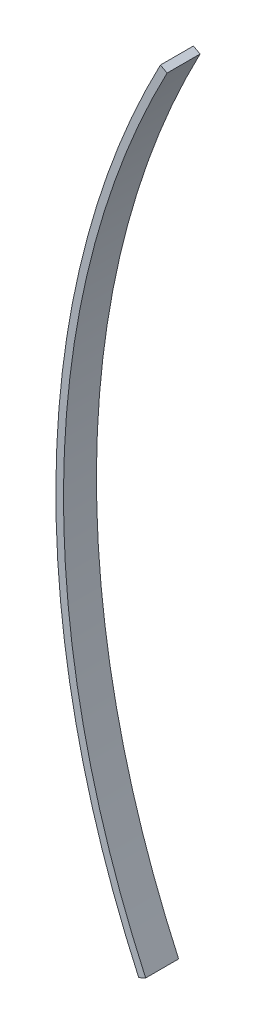
ISO-10303-21;
HEADER;
FILE_DESCRIPTION(('STEP AP214'),'2;1');
FILE_NAME('part.step','',(''),(''),'','','');
FILE_SCHEMA(('AUTOMOTIVE_DESIGN { 1 0 10303 214 1 1 1 1 }'));
ENDSEC;
DATA;
#1=APPLICATION_CONTEXT('core data for automotive mechanical design processes');
#2=APPLICATION_PROTOCOL_DEFINITION('international standard','automotive_design',2000,#1);
#3=PRODUCT_CONTEXT('',#1,'mechanical');
#4=PRODUCT('Part','Part','',(#3));
#5=PRODUCT_RELATED_PRODUCT_CATEGORY('part','',(#4));
#6=PRODUCT_DEFINITION_FORMATION('','',#4);
#7=PRODUCT_DEFINITION_CONTEXT('part definition',#1,'design');
#8=PRODUCT_DEFINITION('design','',#6,#7);
#9=PRODUCT_DEFINITION_SHAPE('','',#8);
#10=(LENGTH_UNIT() NAMED_UNIT(*) SI_UNIT(.MILLI.,.METRE.));
#11=(NAMED_UNIT(*) PLANE_ANGLE_UNIT() SI_UNIT($,.RADIAN.));
#12=(NAMED_UNIT(*) SI_UNIT($,.STERADIAN.) SOLID_ANGLE_UNIT());
#13=UNCERTAINTY_MEASURE_WITH_UNIT(LENGTH_MEASURE(1.E-05),#10,'distance_accuracy_value','');
#14=(GEOMETRIC_REPRESENTATION_CONTEXT(3) GLOBAL_UNCERTAINTY_ASSIGNED_CONTEXT((#13)) GLOBAL_UNIT_ASSIGNED_CONTEXT((#10,
#11,#12)) REPRESENTATION_CONTEXT('',''));
#15=CARTESIAN_POINT('',(0.,0.,0.));
#16=DIRECTION('',(0.,0.,1.));
#17=DIRECTION('',(1.,0.,0.));
#18=AXIS2_PLACEMENT_3D('',#15,#16,#17);
#19=CARTESIAN_POINT('',(166.236633014932,89.3265657433675,-6.5));
#20=DIRECTION('',(0.,0.,1.));
#21=DIRECTION('',(1.,0.,0.));
#22=AXIS2_PLACEMENT_3D('',#19,#20,#21);
#23=CYLINDRICAL_SURFACE('',#22,178.75);
#24=CARTESIAN_POINT('',(166.236633014932,89.3265657433675,0.));
#25=DIRECTION('',(0.,0.,1.));
#26=DIRECTION('',(1.,0.,0.));
#27=AXIS2_PLACEMENT_3D('',#24,#25,#26);
#28=CIRCLE('',#27,178.75);
#29=CARTESIAN_POINT('',(8.09621559097024,172.652257321506,0.));
#30=VERTEX_POINT('',#29);
#31=CARTESIAN_POINT('',(3.82739106057403,14.6619782348925,0.));
#32=VERTEX_POINT('',#31);
#33=EDGE_CURVE('E99',#30,#32,#28,.T.);
#34=ORIENTED_EDGE('',*,*,#33,.F.);
#35=DIRECTION('',(0.,0.,1.));
#36=VECTOR('',#35,1.);
#37=CARTESIAN_POINT('',(8.09621559097024,172.652257321506,-6.5));
#38=LINE('',#37,#36);
#39=CARTESIAN_POINT('',(8.09621559097024,172.652257321506,-6.5));
#40=VERTEX_POINT('',#39);
#41=EDGE_CURVE('E11',#40,#30,#38,.T.);
#42=ORIENTED_EDGE('',*,*,#41,.F.);
#43=CARTESIAN_POINT('',(166.236633014932,89.3265657433675,-6.5));
#44=DIRECTION('',(0.,0.,1.));
#45=DIRECTION('',(1.,0.,0.));
#46=AXIS2_PLACEMENT_3D('',#43,#44,#45);
#47=CIRCLE('',#46,178.75);
#48=CARTESIAN_POINT('',(3.82739106057403,14.6619782348925,-6.5));
#49=VERTEX_POINT('',#48);
#50=EDGE_CURVE('E94',#40,#49,#47,.T.);
#51=ORIENTED_EDGE('',*,*,#50,.T.);
#52=DIRECTION('',(0.,0.,1.));
#53=VECTOR('',#52,1.);
#54=CARTESIAN_POINT('',(3.82739106057403,14.6619782348925,-6.5));
#55=LINE('',#54,#53);
#56=EDGE_CURVE('E37',#49,#32,#55,.T.);
#57=ORIENTED_EDGE('',*,*,#56,.T.);
#58=EDGE_LOOP('',(#34,#42,#51,#57));
#59=FACE_BOUND('',#58,.T.);
#60=ADVANCED_FACE('F34',(#59),#23,.T.);
#61=CARTESIAN_POINT('',(8.09621559097024,172.652257321506,-6.5));
#62=DIRECTION('',(-0.466157715122447,-0.884701635938252,0.));
#63=DIRECTION('',(0.884701635938252,-0.466157715122447,0.));
#64=AXIS2_PLACEMENT_3D('',#61,#62,#63);
#65=PLANE('',#64);
#66=DIRECTION('',(0.884701635938252,-0.466157715122447,0.));
#67=VECTOR('',#66,1.);
#68=CARTESIAN_POINT('',(8.09621559097024,172.652257321506,0.));
#69=LINE('',#68,#67);
#70=CARTESIAN_POINT('',(9.42326804487761,171.953020748822,0.));
#71=VERTEX_POINT('',#70);
#72=EDGE_CURVE('E67',#30,#71,#69,.T.);
#73=ORIENTED_EDGE('',*,*,#72,.T.);
#74=DIRECTION('',(0.,0.,1.));
#75=VECTOR('',#74,1.);
#76=CARTESIAN_POINT('',(9.42326804487761,171.953020748822,-6.5));
#77=LINE('',#76,#75);
#78=CARTESIAN_POINT('',(9.42326804487761,171.953020748822,-6.5));
#79=VERTEX_POINT('',#78);
#80=EDGE_CURVE('E43',#79,#71,#77,.T.);
#81=ORIENTED_EDGE('',*,*,#80,.F.);
#82=DIRECTION('',(0.884701635938252,-0.466157715122447,0.));
#83=VECTOR('',#82,1.);
#84=CARTESIAN_POINT('',(8.09621559097024,172.652257321506,-6.5));
#85=LINE('',#84,#83);
#86=EDGE_CURVE('E82',#40,#79,#85,.T.);
#87=ORIENTED_EDGE('',*,*,#86,.F.);
#88=ORIENTED_EDGE('',*,*,#41,.T.);
#89=EDGE_LOOP('',(#73,#81,#87,#88));
#90=FACE_BOUND('',#89,.T.);
#91=ADVANCED_FACE('F109',(#90),#65,.F.);
#92=CARTESIAN_POINT('',(166.236633014932,89.3265657433675,-6.5));
#93=DIRECTION('',(0.,0.,1.));
#94=DIRECTION('',(1.,0.,0.));
#95=AXIS2_PLACEMENT_3D('',#92,#93,#94);
#96=CYLINDRICAL_SURFACE('',#95,177.25);
#97=CARTESIAN_POINT('',(166.236633014932,89.3265657433675,0.));
#98=DIRECTION('',(0.,0.,1.));
#99=DIRECTION('',(1.,0.,0.));
#100=AXIS2_PLACEMENT_3D('',#97,#98,#99);
#101=CIRCLE('',#100,177.25);
#102=CARTESIAN_POINT('',(5.19026581823298,15.2885342139846,0.));
#103=VERTEX_POINT('',#102);
#104=EDGE_CURVE('E89',#71,#103,#101,.T.);
#105=ORIENTED_EDGE('',*,*,#104,.T.);
#106=DIRECTION('',(0.,0.,1.));
#107=VECTOR('',#106,1.);
#108=CARTESIAN_POINT('',(5.19026581823298,15.2885342139846,-6.5));
#109=LINE('',#108,#107);
#110=CARTESIAN_POINT('',(5.19026581823298,15.2885342139846,-6.5));
#111=VERTEX_POINT('',#110);
#112=EDGE_CURVE('E86',#111,#103,#109,.T.);
#113=ORIENTED_EDGE('',*,*,#112,.F.);
#114=CARTESIAN_POINT('',(166.236633014932,89.3265657433675,-6.5));
#115=DIRECTION('',(0.,0.,1.));
#116=DIRECTION('',(1.,0.,0.));
#117=AXIS2_PLACEMENT_3D('',#114,#115,#116);
#118=CIRCLE('',#117,177.25);
#119=EDGE_CURVE('E79',#79,#111,#118,.T.);
#120=ORIENTED_EDGE('',*,*,#119,.F.);
#121=ORIENTED_EDGE('',*,*,#80,.T.);
#122=EDGE_LOOP('',(#105,#113,#120,#121));
#123=FACE_BOUND('',#122,.T.);
#124=ADVANCED_FACE('F87',(#123),#96,.F.);
#125=CARTESIAN_POINT('',(5.19026581823298,15.2885342139846,-6.5));
#126=DIRECTION('',(-0.417703986061392,0.908583171772636,0.));
#127=DIRECTION('',(-0.908583171772636,-0.417703986061392,0.));
#128=AXIS2_PLACEMENT_3D('',#125,#126,#127);
#129=PLANE('',#128);
#130=DIRECTION('',(-0.908583171772636,-0.417703986061392,0.));
#131=VECTOR('',#130,1.);
#132=CARTESIAN_POINT('',(5.19026581823298,15.2885342139846,0.));
#133=LINE('',#132,#131);
#134=EDGE_CURVE('E102',#103,#32,#133,.T.);
#135=ORIENTED_EDGE('',*,*,#134,.T.);
#136=ORIENTED_EDGE('',*,*,#56,.F.);
#137=DIRECTION('',(-0.908583171772636,-0.417703986061392,0.));
#138=VECTOR('',#137,1.);
#139=CARTESIAN_POINT('',(5.19026581823298,15.2885342139846,-6.5));
#140=LINE('',#139,#138);
#141=EDGE_CURVE('E76',#111,#49,#140,.T.);
#142=ORIENTED_EDGE('',*,*,#141,.F.);
#143=ORIENTED_EDGE('',*,*,#112,.T.);
#144=EDGE_LOOP('',(#135,#136,#142,#143));
#145=FACE_BOUND('',#144,.T.);
#146=ADVANCED_FACE('F93',(#145),#129,.F.);
#147=CARTESIAN_POINT('',(166.236633014932,89.3265657433675,-6.5));
#148=DIRECTION('',(0.,0.,1.));
#149=DIRECTION('',(1.,0.,0.));
#150=AXIS2_PLACEMENT_3D('',#147,#148,#149);
#151=PLANE('',#150);
#152=ORIENTED_EDGE('',*,*,#50,.F.);
#153=ORIENTED_EDGE('',*,*,#86,.T.);
#154=ORIENTED_EDGE('',*,*,#119,.T.);
#155=ORIENTED_EDGE('',*,*,#141,.T.);
#156=EDGE_LOOP('',(#152,#153,#154,#155));
#157=FACE_BOUND('',#156,.T.);
#158=ADVANCED_FACE('F81',(#157),#151,.F.);
#159=CARTESIAN_POINT('',(166.236633014932,89.3265657433675,0.));
#160=DIRECTION('',(0.,0.,1.));
#161=DIRECTION('',(1.,0.,0.));
#162=AXIS2_PLACEMENT_3D('',#159,#160,#161);
#163=PLANE('',#162);
#164=ORIENTED_EDGE('',*,*,#33,.T.);
#165=ORIENTED_EDGE('',*,*,#134,.F.);
#166=ORIENTED_EDGE('',*,*,#104,.F.);
#167=ORIENTED_EDGE('',*,*,#72,.F.);
#168=EDGE_LOOP('',(#164,#165,#166,#167));
#169=FACE_BOUND('',#168,.T.);
#170=ADVANCED_FACE('F107',(#169),#163,.T.);
#171=CLOSED_SHELL('',(#60,#91,#124,#146,#158,#170));
#172=MANIFOLD_SOLID_BREP('B2',#171);
#173=ADVANCED_BREP_SHAPE_REPRESENTATION('',(#18,#172),#14);
#174=SHAPE_DEFINITION_REPRESENTATION(#9,#173);
ENDSEC;
END-ISO-10303-21;
